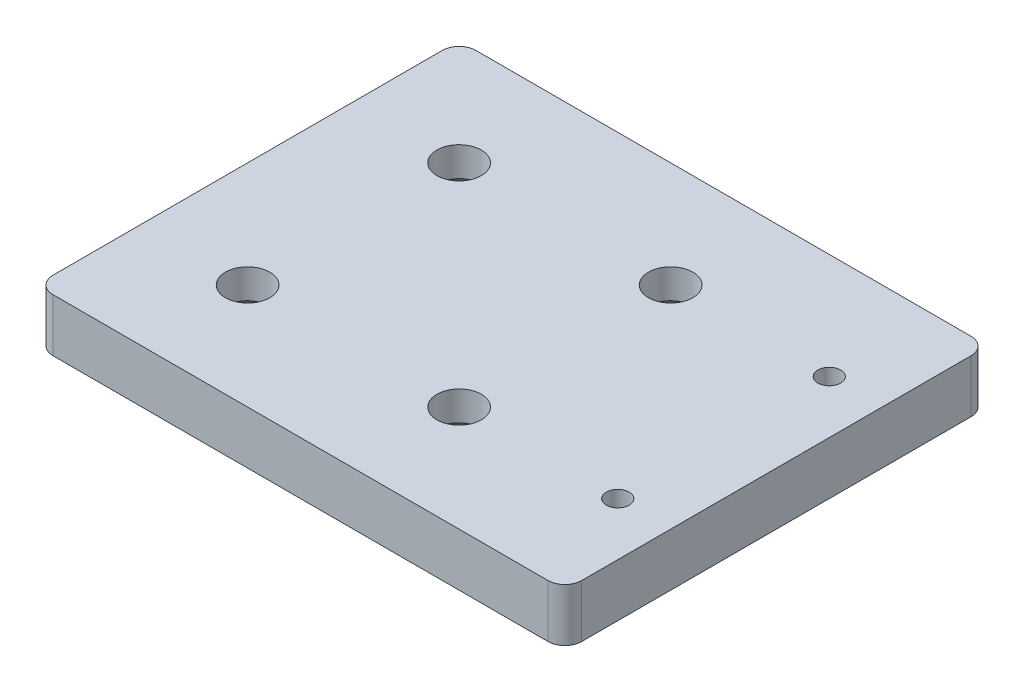
ISO-10303-21;
HEADER;
FILE_DESCRIPTION(('STEP AP214'),'2;1');
FILE_NAME('part.step','',(''),(''),'','','');
FILE_SCHEMA(('AUTOMOTIVE_DESIGN { 1 0 10303 214 1 1 1 1 }'));
ENDSEC;
DATA;
#1=APPLICATION_CONTEXT('core data for automotive mechanical design processes');
#2=APPLICATION_PROTOCOL_DEFINITION('international standard','automotive_design',2000,#1);
#3=PRODUCT_CONTEXT('',#1,'mechanical');
#4=PRODUCT('Part','Part','',(#3));
#5=PRODUCT_RELATED_PRODUCT_CATEGORY('part','',(#4));
#6=PRODUCT_DEFINITION_FORMATION('','',#4);
#7=PRODUCT_DEFINITION_CONTEXT('part definition',#1,'design');
#8=PRODUCT_DEFINITION('design','',#6,#7);
#9=PRODUCT_DEFINITION_SHAPE('','',#8);
#10=(LENGTH_UNIT() NAMED_UNIT(*) SI_UNIT(.MILLI.,.METRE.));
#11=(NAMED_UNIT(*) PLANE_ANGLE_UNIT() SI_UNIT($,.RADIAN.));
#12=(NAMED_UNIT(*) SI_UNIT($,.STERADIAN.) SOLID_ANGLE_UNIT());
#13=UNCERTAINTY_MEASURE_WITH_UNIT(LENGTH_MEASURE(1.E-05),#10,'distance_accuracy_value','');
#14=(GEOMETRIC_REPRESENTATION_CONTEXT(3) GLOBAL_UNCERTAINTY_ASSIGNED_CONTEXT((#13)) GLOBAL_UNIT_ASSIGNED_CONTEXT((#10,
#11,#12)) REPRESENTATION_CONTEXT('',''));
#15=CARTESIAN_POINT('',(0.,0.,0.));
#16=DIRECTION('',(0.,0.,1.));
#17=DIRECTION('',(1.,0.,0.));
#18=AXIS2_PLACEMENT_3D('',#15,#16,#17);
#19=CARTESIAN_POINT('',(-46.82,10.,36.82));
#20=DIRECTION('',(0.,-1.,0.));
#21=DIRECTION('',(0.,0.,-1.));
#22=AXIS2_PLACEMENT_3D('',#19,#20,#21);
#23=CYLINDRICAL_SURFACE('',#22,3.17999999999999);
#24=CARTESIAN_POINT('',(-46.82,0.,36.82));
#25=DIRECTION('',(0.,-1.,0.));
#26=DIRECTION('',(0.,0.,-1.));
#27=AXIS2_PLACEMENT_3D('',#24,#25,#26);
#28=CIRCLE('',#27,3.17999999999999);
#29=CARTESIAN_POINT('',(-46.82,0.,40.));
#30=VERTEX_POINT('',#29);
#31=CARTESIAN_POINT('',(-50.,0.,36.82));
#32=VERTEX_POINT('',#31);
#33=EDGE_CURVE('E140',#30,#32,#28,.T.);
#34=ORIENTED_EDGE('',*,*,#33,.F.);
#35=DIRECTION('',(0.,-1.,0.));
#36=VECTOR('',#35,1.);
#37=CARTESIAN_POINT('',(-46.82,10.,40.));
#38=LINE('',#37,#36);
#39=CARTESIAN_POINT('',(-46.82,10.,40.));
#40=VERTEX_POINT('',#39);
#41=EDGE_CURVE('E11',#40,#30,#38,.T.);
#42=ORIENTED_EDGE('',*,*,#41,.F.);
#43=CARTESIAN_POINT('',(-46.82,10.,36.82));
#44=DIRECTION('',(0.,-1.,0.));
#45=DIRECTION('',(0.,0.,-1.));
#46=AXIS2_PLACEMENT_3D('',#43,#44,#45);
#47=CIRCLE('',#46,3.17999999999999);
#48=CARTESIAN_POINT('',(-50.,10.,36.82));
#49=VERTEX_POINT('',#48);
#50=EDGE_CURVE('E160',#40,#49,#47,.T.);
#51=ORIENTED_EDGE('',*,*,#50,.T.);
#52=DIRECTION('',(0.,-1.,0.));
#53=VECTOR('',#52,1.);
#54=CARTESIAN_POINT('',(-50.,10.,36.82));
#55=LINE('',#54,#53);
#56=EDGE_CURVE('E45',#49,#32,#55,.T.);
#57=ORIENTED_EDGE('',*,*,#56,.T.);
#58=EDGE_LOOP('',(#34,#42,#51,#57));
#59=FACE_BOUND('',#58,.T.);
#60=ADVANCED_FACE('F39',(#59),#23,.T.);
#61=CARTESIAN_POINT('',(-46.82,10.,40.));
#62=DIRECTION('',(0.,0.,-1.));
#63=DIRECTION('',(-1.,0.,0.));
#64=AXIS2_PLACEMENT_3D('',#61,#62,#63);
#65=PLANE('',#64);
#66=DIRECTION('',(1.,0.,0.));
#67=VECTOR('',#66,1.);
#68=CARTESIAN_POINT('',(-46.82,0.,40.));
#69=LINE('',#68,#67);
#70=CARTESIAN_POINT('',(46.82,0.,40.));
#71=VERTEX_POINT('',#70);
#72=EDGE_CURVE('E81',#30,#71,#69,.T.);
#73=ORIENTED_EDGE('',*,*,#72,.T.);
#74=DIRECTION('',(0.,-1.,0.));
#75=VECTOR('',#74,1.);
#76=CARTESIAN_POINT('',(46.82,10.,40.));
#77=LINE('',#76,#75);
#78=CARTESIAN_POINT('',(46.82,10.,40.));
#79=VERTEX_POINT('',#78);
#80=EDGE_CURVE('E48',#79,#71,#77,.T.);
#81=ORIENTED_EDGE('',*,*,#80,.F.);
#82=DIRECTION('',(1.,0.,0.));
#83=VECTOR('',#82,1.);
#84=CARTESIAN_POINT('',(-46.82,10.,40.));
#85=LINE('',#84,#83);
#86=EDGE_CURVE('E119',#40,#79,#85,.T.);
#87=ORIENTED_EDGE('',*,*,#86,.F.);
#88=ORIENTED_EDGE('',*,*,#41,.T.);
#89=EDGE_LOOP('',(#73,#81,#87,#88));
#90=FACE_BOUND('',#89,.T.);
#91=ADVANCED_FACE('F264',(#90),#65,.F.);
#92=CARTESIAN_POINT('',(46.82,10.,36.82));
#93=DIRECTION('',(0.,-1.,0.));
#94=DIRECTION('',(0.,0.,-1.));
#95=AXIS2_PLACEMENT_3D('',#92,#93,#94);
#96=CYLINDRICAL_SURFACE('',#95,3.18);
#97=CARTESIAN_POINT('',(46.82,0.,36.82));
#98=DIRECTION('',(0.,1.,0.));
#99=DIRECTION('',(0.,0.,1.));
#100=AXIS2_PLACEMENT_3D('',#97,#98,#99);
#101=CIRCLE('',#100,3.18);
#102=CARTESIAN_POINT('',(50.,0.,36.82));
#103=VERTEX_POINT('',#102);
#104=EDGE_CURVE('E125',#71,#103,#101,.T.);
#105=ORIENTED_EDGE('',*,*,#104,.T.);
#106=DIRECTION('',(0.,-1.,0.));
#107=VECTOR('',#106,1.);
#108=CARTESIAN_POINT('',(50.,10.,36.82));
#109=LINE('',#108,#107);
#110=CARTESIAN_POINT('',(50.,10.,36.82));
#111=VERTEX_POINT('',#110);
#112=EDGE_CURVE('E117',#111,#103,#109,.T.);
#113=ORIENTED_EDGE('',*,*,#112,.F.);
#114=CARTESIAN_POINT('',(46.82,10.,36.82));
#115=DIRECTION('',(0.,1.,0.));
#116=DIRECTION('',(0.,0.,1.));
#117=AXIS2_PLACEMENT_3D('',#114,#115,#116);
#118=CIRCLE('',#117,3.18);
#119=EDGE_CURVE('E107',#79,#111,#118,.T.);
#120=ORIENTED_EDGE('',*,*,#119,.F.);
#121=ORIENTED_EDGE('',*,*,#80,.T.);
#122=EDGE_LOOP('',(#105,#113,#120,#121));
#123=FACE_BOUND('',#122,.T.);
#124=ADVANCED_FACE('F122',(#123),#96,.T.);
#125=CARTESIAN_POINT('',(50.,10.,36.82));
#126=DIRECTION('',(-1.,0.,0.));
#127=DIRECTION('',(0.,0.,1.));
#128=AXIS2_PLACEMENT_3D('',#125,#126,#127);
#129=PLANE('',#128);
#130=DIRECTION('',(0.,0.,-1.));
#131=VECTOR('',#130,1.);
#132=CARTESIAN_POINT('',(50.,0.,36.82));
#133=LINE('',#132,#131);
#134=CARTESIAN_POINT('',(50.,0.,-36.82));
#135=VERTEX_POINT('',#134);
#136=EDGE_CURVE('E152',#103,#135,#133,.T.);
#137=ORIENTED_EDGE('',*,*,#136,.T.);
#138=DIRECTION('',(0.,-1.,0.));
#139=VECTOR('',#138,1.);
#140=CARTESIAN_POINT('',(50.,10.,-36.82));
#141=LINE('',#140,#139);
#142=CARTESIAN_POINT('',(50.,10.,-36.82));
#143=VERTEX_POINT('',#142);
#144=EDGE_CURVE('E130',#143,#135,#141,.T.);
#145=ORIENTED_EDGE('',*,*,#144,.F.);
#146=DIRECTION('',(0.,0.,-1.));
#147=VECTOR('',#146,1.);
#148=CARTESIAN_POINT('',(50.,10.,36.82));
#149=LINE('',#148,#147);
#150=EDGE_CURVE('E111',#111,#143,#149,.T.);
#151=ORIENTED_EDGE('',*,*,#150,.F.);
#152=ORIENTED_EDGE('',*,*,#112,.T.);
#153=EDGE_LOOP('',(#137,#145,#151,#152));
#154=FACE_BOUND('',#153,.T.);
#155=ADVANCED_FACE('F129',(#154),#129,.F.);
#156=CARTESIAN_POINT('',(46.82,10.,-36.82));
#157=DIRECTION('',(0.,-1.,0.));
#158=DIRECTION('',(0.,0.,-1.));
#159=AXIS2_PLACEMENT_3D('',#156,#157,#158);
#160=CYLINDRICAL_SURFACE('',#159,3.18);
#161=CARTESIAN_POINT('',(46.82,0.,-36.82));
#162=DIRECTION('',(0.,-1.,0.));
#163=DIRECTION('',(0.,0.,-1.));
#164=AXIS2_PLACEMENT_3D('',#161,#162,#163);
#165=CIRCLE('',#164,3.18);
#166=CARTESIAN_POINT('',(46.82,0.,-40.));
#167=VERTEX_POINT('',#166);
#168=EDGE_CURVE('E151',#167,#135,#165,.T.);
#169=ORIENTED_EDGE('',*,*,#168,.F.);
#170=DIRECTION('',(0.,-1.,0.));
#171=VECTOR('',#170,1.);
#172=CARTESIAN_POINT('',(46.82,10.,-40.));
#173=LINE('',#172,#171);
#174=CARTESIAN_POINT('',(46.82,10.,-40.));
#175=VERTEX_POINT('',#174);
#176=EDGE_CURVE('E161',#175,#167,#173,.T.);
#177=ORIENTED_EDGE('',*,*,#176,.F.);
#178=CARTESIAN_POINT('',(46.82,10.,-36.82));
#179=DIRECTION('',(0.,-1.,0.));
#180=DIRECTION('',(0.,0.,-1.));
#181=AXIS2_PLACEMENT_3D('',#178,#179,#180);
#182=CIRCLE('',#181,3.18);
#183=EDGE_CURVE('E134',#175,#143,#182,.T.);
#184=ORIENTED_EDGE('',*,*,#183,.T.);
#185=ORIENTED_EDGE('',*,*,#144,.T.);
#186=EDGE_LOOP('',(#169,#177,#184,#185));
#187=FACE_BOUND('',#186,.T.);
#188=ADVANCED_FACE('F171',(#187),#160,.T.);
#189=CARTESIAN_POINT('',(-46.82,10.,-40.));
#190=DIRECTION('',(0.,0.,-1.));
#191=DIRECTION('',(-1.,0.,0.));
#192=AXIS2_PLACEMENT_3D('',#189,#190,#191);
#193=PLANE('',#192);
#194=DIRECTION('',(1.,0.,0.));
#195=VECTOR('',#194,1.);
#196=CARTESIAN_POINT('',(-46.82,0.,-40.));
#197=LINE('',#196,#195);
#198=CARTESIAN_POINT('',(-46.82,0.,-40.));
#199=VERTEX_POINT('',#198);
#200=EDGE_CURVE('E146',#199,#167,#197,.T.);
#201=ORIENTED_EDGE('',*,*,#200,.F.);
#202=DIRECTION('',(0.,-1.,0.));
#203=VECTOR('',#202,1.);
#204=CARTESIAN_POINT('',(-46.82,10.,-40.));
#205=LINE('',#204,#203);
#206=CARTESIAN_POINT('',(-46.82,10.,-40.));
#207=VERTEX_POINT('',#206);
#208=EDGE_CURVE('E162',#207,#199,#205,.T.);
#209=ORIENTED_EDGE('',*,*,#208,.F.);
#210=DIRECTION('',(1.,0.,0.));
#211=VECTOR('',#210,1.);
#212=CARTESIAN_POINT('',(-46.82,10.,-40.));
#213=LINE('',#212,#211);
#214=EDGE_CURVE('E135',#207,#175,#213,.T.);
#215=ORIENTED_EDGE('',*,*,#214,.T.);
#216=ORIENTED_EDGE('',*,*,#176,.T.);
#217=EDGE_LOOP('',(#201,#209,#215,#216));
#218=FACE_BOUND('',#217,.T.);
#219=ADVANCED_FACE('F180',(#218),#193,.T.);
#220=CARTESIAN_POINT('',(-46.82,10.,-36.82));
#221=DIRECTION('',(0.,-1.,0.));
#222=DIRECTION('',(0.,0.,-1.));
#223=AXIS2_PLACEMENT_3D('',#220,#221,#222);
#224=CYLINDRICAL_SURFACE('',#223,3.18);
#225=CARTESIAN_POINT('',(-46.82,0.,-36.82));
#226=DIRECTION('',(0.,-1.,0.));
#227=DIRECTION('',(0.,0.,-1.));
#228=AXIS2_PLACEMENT_3D('',#225,#226,#227);
#229=CIRCLE('',#228,3.18);
#230=CARTESIAN_POINT('',(-50.,0.,-36.82));
#231=VERTEX_POINT('',#230);
#232=EDGE_CURVE('E144',#231,#199,#229,.T.);
#233=ORIENTED_EDGE('',*,*,#232,.F.);
#234=DIRECTION('',(0.,-1.,0.));
#235=VECTOR('',#234,1.);
#236=CARTESIAN_POINT('',(-50.,10.,-36.82));
#237=LINE('',#236,#235);
#238=CARTESIAN_POINT('',(-50.,10.,-36.82));
#239=VERTEX_POINT('',#238);
#240=EDGE_CURVE('E163',#239,#231,#237,.T.);
#241=ORIENTED_EDGE('',*,*,#240,.F.);
#242=CARTESIAN_POINT('',(-46.82,10.,-36.82));
#243=DIRECTION('',(0.,-1.,0.));
#244=DIRECTION('',(0.,0.,-1.));
#245=AXIS2_PLACEMENT_3D('',#242,#243,#244);
#246=CIRCLE('',#245,3.18);
#247=EDGE_CURVE('E176',#239,#207,#246,.T.);
#248=ORIENTED_EDGE('',*,*,#247,.T.);
#249=ORIENTED_EDGE('',*,*,#208,.T.);
#250=EDGE_LOOP('',(#233,#241,#248,#249));
#251=FACE_BOUND('',#250,.T.);
#252=ADVANCED_FACE('F281',(#251),#224,.T.);
#253=CARTESIAN_POINT('',(-50.,10.,36.82));
#254=DIRECTION('',(-1.,0.,0.));
#255=DIRECTION('',(0.,0.,1.));
#256=AXIS2_PLACEMENT_3D('',#253,#254,#255);
#257=PLANE('',#256);
#258=DIRECTION('',(0.,0.,-1.));
#259=VECTOR('',#258,1.);
#260=CARTESIAN_POINT('',(-50.,0.,36.82));
#261=LINE('',#260,#259);
#262=EDGE_CURVE('E143',#32,#231,#261,.T.);
#263=ORIENTED_EDGE('',*,*,#262,.F.);
#264=ORIENTED_EDGE('',*,*,#56,.F.);
#265=DIRECTION('',(0.,0.,-1.));
#266=VECTOR('',#265,1.);
#267=CARTESIAN_POINT('',(-50.,10.,36.82));
#268=LINE('',#267,#266);
#269=EDGE_CURVE('E178',#49,#239,#268,.T.);
#270=ORIENTED_EDGE('',*,*,#269,.T.);
#271=ORIENTED_EDGE('',*,*,#240,.T.);
#272=EDGE_LOOP('',(#263,#264,#270,#271));
#273=FACE_BOUND('',#272,.T.);
#274=ADVANCED_FACE('F167',(#273),#257,.T.);
#275=CARTESIAN_POINT('',(-46.82,10.,36.82));
#276=DIRECTION('',(0.,-1.,0.));
#277=DIRECTION('',(0.,0.,-1.));
#278=AXIS2_PLACEMENT_3D('',#275,#276,#277);
#279=PLANE('',#278);
#280=CARTESIAN_POINT('',(39.9999999999994,10.,-19.9999999999999));
#281=DIRECTION('',(0.,-1.,0.));
#282=DIRECTION('',(0.,0.,-1.));
#283=AXIS2_PLACEMENT_3D('',#280,#281,#282);
#284=CIRCLE('',#283,2.15);
#285=CARTESIAN_POINT('',(39.9999999999994,10.,-22.1499999999999));
#286=VERTEX_POINT('',#285);
#287=EDGE_CURVE('E229',#286,#286,#284,.T.);
#288=ORIENTED_EDGE('',*,*,#287,.T.);
#289=EDGE_LOOP('',(#288));
#290=FACE_BOUND('',#289,.T.);
#291=CARTESIAN_POINT('',(40.,10.,19.999999999999));
#292=DIRECTION('',(0.,-1.,0.));
#293=DIRECTION('',(0.,0.,-1.));
#294=AXIS2_PLACEMENT_3D('',#291,#292,#293);
#295=CIRCLE('',#294,2.15);
#296=CARTESIAN_POINT('',(40.,10.,17.849999999999));
#297=VERTEX_POINT('',#296);
#298=EDGE_CURVE('E219',#297,#297,#295,.T.);
#299=ORIENTED_EDGE('',*,*,#298,.T.);
#300=EDGE_LOOP('',(#299));
#301=FACE_BOUND('',#300,.T.);
#302=CARTESIAN_POINT('',(10.,9.99999999999999,-20.));
#303=DIRECTION('',(0.,-1.,0.));
#304=DIRECTION('',(0.,0.,-1.));
#305=AXIS2_PLACEMENT_3D('',#302,#303,#304);
#306=CIRCLE('',#305,4.19999999999999);
#307=CARTESIAN_POINT('',(10.,9.99999999999999,-24.2));
#308=VERTEX_POINT('',#307);
#309=EDGE_CURVE('E211',#308,#308,#306,.T.);
#310=ORIENTED_EDGE('',*,*,#309,.T.);
#311=EDGE_LOOP('',(#310));
#312=FACE_BOUND('',#311,.T.);
#313=CARTESIAN_POINT('',(-30.0000000000008,9.99999999999999,-19.9999999999989));
#314=DIRECTION('',(0.,-1.,0.));
#315=DIRECTION('',(0.,0.,-1.));
#316=AXIS2_PLACEMENT_3D('',#313,#314,#315);
#317=CIRCLE('',#316,4.19999999999999);
#318=CARTESIAN_POINT('',(-30.0000000000008,9.99999999999999,-24.1999999999989));
#319=VERTEX_POINT('',#318);
#320=EDGE_CURVE('E205',#319,#319,#317,.T.);
#321=ORIENTED_EDGE('',*,*,#320,.T.);
#322=EDGE_LOOP('',(#321));
#323=FACE_BOUND('',#322,.T.);
#324=CARTESIAN_POINT('',(-29.9999999999996,9.99999999999999,20.));
#325=DIRECTION('',(0.,-1.,0.));
#326=DIRECTION('',(0.,0.,-1.));
#327=AXIS2_PLACEMENT_3D('',#324,#325,#326);
#328=CIRCLE('',#327,4.19999999999999);
#329=CARTESIAN_POINT('',(-29.9999999999996,9.99999999999999,15.8));
#330=VERTEX_POINT('',#329);
#331=EDGE_CURVE('E195',#330,#330,#328,.T.);
#332=ORIENTED_EDGE('',*,*,#331,.T.);
#333=EDGE_LOOP('',(#332));
#334=FACE_BOUND('',#333,.T.);
#335=CARTESIAN_POINT('',(10.0000000000004,9.99999999999999,20.));
#336=DIRECTION('',(0.,-1.,0.));
#337=DIRECTION('',(0.,0.,-1.));
#338=AXIS2_PLACEMENT_3D('',#335,#336,#337);
#339=CIRCLE('',#338,4.19999999999999);
#340=CARTESIAN_POINT('',(10.0000000000004,9.99999999999999,15.8));
#341=VERTEX_POINT('',#340);
#342=EDGE_CURVE('E142',#341,#341,#339,.T.);
#343=ORIENTED_EDGE('',*,*,#342,.T.);
#344=EDGE_LOOP('',(#343));
#345=FACE_BOUND('',#344,.T.);
#346=ORIENTED_EDGE('',*,*,#50,.F.);
#347=ORIENTED_EDGE('',*,*,#86,.T.);
#348=ORIENTED_EDGE('',*,*,#119,.T.);
#349=ORIENTED_EDGE('',*,*,#150,.T.);
#350=ORIENTED_EDGE('',*,*,#183,.F.);
#351=ORIENTED_EDGE('',*,*,#214,.F.);
#352=ORIENTED_EDGE('',*,*,#247,.F.);
#353=ORIENTED_EDGE('',*,*,#269,.F.);
#354=EDGE_LOOP('',(#346,#347,#348,#349,#350,#351,#352,#353));
#355=FACE_BOUND('',#354,.T.);
#356=ADVANCED_FACE('F112',(#290,#301,#312,#323,#334,#345,#355),#279,.F.);
#357=CARTESIAN_POINT('',(-46.82,0.,36.82));
#358=DIRECTION('',(0.,-1.,0.));
#359=DIRECTION('',(0.,0.,-1.));
#360=AXIS2_PLACEMENT_3D('',#357,#358,#359);
#361=PLANE('',#360);
#362=CARTESIAN_POINT('',(39.9999999999994,0.,-19.9999999999999));
#363=DIRECTION('',(0.,-1.,0.));
#364=DIRECTION('',(0.,0.,-1.));
#365=AXIS2_PLACEMENT_3D('',#362,#363,#364);
#366=CIRCLE('',#365,2.15);
#367=CARTESIAN_POINT('',(39.9999999999994,0.,-22.1499999999999));
#368=VERTEX_POINT('',#367);
#369=EDGE_CURVE('E228',#368,#368,#366,.T.);
#370=ORIENTED_EDGE('',*,*,#369,.F.);
#371=EDGE_LOOP('',(#370));
#372=FACE_BOUND('',#371,.T.);
#373=CARTESIAN_POINT('',(40.,0.,19.999999999999));
#374=DIRECTION('',(0.,-1.,0.));
#375=DIRECTION('',(0.,0.,-1.));
#376=AXIS2_PLACEMENT_3D('',#373,#374,#375);
#377=CIRCLE('',#376,2.15);
#378=CARTESIAN_POINT('',(40.,0.,17.849999999999));
#379=VERTEX_POINT('',#378);
#380=EDGE_CURVE('E224',#379,#379,#377,.T.);
#381=ORIENTED_EDGE('',*,*,#380,.F.);
#382=EDGE_LOOP('',(#381));
#383=FACE_BOUND('',#382,.T.);
#384=CARTESIAN_POINT('',(10.,0.,-20.));
#385=DIRECTION('',(0.,-1.,0.));
#386=DIRECTION('',(0.,0.,-1.));
#387=AXIS2_PLACEMENT_3D('',#384,#385,#386);
#388=CIRCLE('',#387,8.65);
#389=CARTESIAN_POINT('',(10.,0.,-28.65));
#390=VERTEX_POINT('',#389);
#391=EDGE_CURVE('E220',#390,#390,#388,.T.);
#392=ORIENTED_EDGE('',*,*,#391,.F.);
#393=EDGE_LOOP('',(#392));
#394=FACE_BOUND('',#393,.T.);
#395=CARTESIAN_POINT('',(-30.0000000000008,0.,-19.9999999999989));
#396=DIRECTION('',(0.,-1.,0.));
#397=DIRECTION('',(0.,0.,-1.));
#398=AXIS2_PLACEMENT_3D('',#395,#396,#397);
#399=CIRCLE('',#398,8.65);
#400=CARTESIAN_POINT('',(-30.0000000000008,0.,-28.6499999999989));
#401=VERTEX_POINT('',#400);
#402=EDGE_CURVE('E208',#401,#401,#399,.T.);
#403=ORIENTED_EDGE('',*,*,#402,.F.);
#404=EDGE_LOOP('',(#403));
#405=FACE_BOUND('',#404,.T.);
#406=CARTESIAN_POINT('',(-29.9999999999996,0.,20.));
#407=DIRECTION('',(0.,-1.,0.));
#408=DIRECTION('',(0.,0.,-1.));
#409=AXIS2_PLACEMENT_3D('',#406,#407,#408);
#410=CIRCLE('',#409,8.65);
#411=CARTESIAN_POINT('',(-29.9999999999996,0.,11.35));
#412=VERTEX_POINT('',#411);
#413=EDGE_CURVE('E200',#412,#412,#410,.T.);
#414=ORIENTED_EDGE('',*,*,#413,.F.);
#415=EDGE_LOOP('',(#414));
#416=FACE_BOUND('',#415,.T.);
#417=CARTESIAN_POINT('',(10.0000000000004,0.,20.));
#418=DIRECTION('',(0.,-1.,0.));
#419=DIRECTION('',(0.,0.,-1.));
#420=AXIS2_PLACEMENT_3D('',#417,#418,#419);
#421=CIRCLE('',#420,8.65);
#422=CARTESIAN_POINT('',(10.0000000000004,0.,11.35));
#423=VERTEX_POINT('',#422);
#424=EDGE_CURVE('E187',#423,#423,#421,.T.);
#425=ORIENTED_EDGE('',*,*,#424,.F.);
#426=EDGE_LOOP('',(#425));
#427=FACE_BOUND('',#426,.T.);
#428=ORIENTED_EDGE('',*,*,#33,.T.);
#429=ORIENTED_EDGE('',*,*,#262,.T.);
#430=ORIENTED_EDGE('',*,*,#232,.T.);
#431=ORIENTED_EDGE('',*,*,#200,.T.);
#432=ORIENTED_EDGE('',*,*,#168,.T.);
#433=ORIENTED_EDGE('',*,*,#136,.F.);
#434=ORIENTED_EDGE('',*,*,#104,.F.);
#435=ORIENTED_EDGE('',*,*,#72,.F.);
#436=EDGE_LOOP('',(#428,#429,#430,#431,#432,#433,#434,#435));
#437=FACE_BOUND('',#436,.T.);
#438=ADVANCED_FACE('F169',(#372,#383,#394,#405,#416,#427,#437),#361,.T.);
#439=CARTESIAN_POINT('',(10.0000000000004,0.,20.));
#440=DIRECTION('',(0.,-1.,0.));
#441=DIRECTION('',(0.,0.,-1.));
#442=AXIS2_PLACEMENT_3D('',#439,#440,#441);
#443=CYLINDRICAL_SURFACE('',#442,4.19999999999999);
#444=ORIENTED_EDGE('',*,*,#342,.F.);
#445=EDGE_LOOP('',(#444));
#446=FACE_BOUND('',#445,.T.);
#447=CARTESIAN_POINT('',(10.0000000000004,4.45,20.));
#448=DIRECTION('',(0.,-1.,0.));
#449=DIRECTION('',(0.,0.,-1.));
#450=AXIS2_PLACEMENT_3D('',#447,#448,#449);
#451=CIRCLE('',#450,4.2);
#452=CARTESIAN_POINT('',(10.0000000000004,4.45,15.8));
#453=VERTEX_POINT('',#452);
#454=EDGE_CURVE('E186',#453,#453,#451,.T.);
#455=ORIENTED_EDGE('',*,*,#454,.T.);
#456=EDGE_LOOP('',(#455));
#457=FACE_BOUND('',#456,.T.);
#458=ADVANCED_FACE('F240',(#446,#457),#443,.F.);
#459=CARTESIAN_POINT('',(10.0000000000004,0.,20.));
#460=DIRECTION('',(0.,-1.,0.));
#461=DIRECTION('',(0.,0.,-1.));
#462=AXIS2_PLACEMENT_3D('',#459,#460,#461);
#463=CONICAL_SURFACE('',#462,8.65,0.785398163397449);
#464=ORIENTED_EDGE('',*,*,#454,.F.);
#465=EDGE_LOOP('',(#464));
#466=FACE_BOUND('',#465,.T.);
#467=ORIENTED_EDGE('',*,*,#424,.T.);
#468=EDGE_LOOP('',(#467));
#469=FACE_BOUND('',#468,.T.);
#470=ADVANCED_FACE('F246',(#466,#469),#463,.F.);
#471=CARTESIAN_POINT('',(-29.9999999999996,0.,20.));
#472=DIRECTION('',(0.,-1.,0.));
#473=DIRECTION('',(0.,0.,-1.));
#474=AXIS2_PLACEMENT_3D('',#471,#472,#473);
#475=CYLINDRICAL_SURFACE('',#474,4.19999999999999);
#476=ORIENTED_EDGE('',*,*,#331,.F.);
#477=EDGE_LOOP('',(#476));
#478=FACE_BOUND('',#477,.T.);
#479=CARTESIAN_POINT('',(-29.9999999999996,4.45,20.));
#480=DIRECTION('',(0.,-1.,0.));
#481=DIRECTION('',(0.,0.,-1.));
#482=AXIS2_PLACEMENT_3D('',#479,#480,#481);
#483=CIRCLE('',#482,4.2);
#484=CARTESIAN_POINT('',(-29.9999999999996,4.45,15.8));
#485=VERTEX_POINT('',#484);
#486=EDGE_CURVE('E198',#485,#485,#483,.T.);
#487=ORIENTED_EDGE('',*,*,#486,.T.);
#488=EDGE_LOOP('',(#487));
#489=FACE_BOUND('',#488,.T.);
#490=ADVANCED_FACE('F253',(#478,#489),#475,.F.);
#491=CARTESIAN_POINT('',(-29.9999999999996,0.,20.));
#492=DIRECTION('',(0.,-1.,0.));
#493=DIRECTION('',(0.,0.,-1.));
#494=AXIS2_PLACEMENT_3D('',#491,#492,#493);
#495=CONICAL_SURFACE('',#494,8.65,0.785398163397449);
#496=ORIENTED_EDGE('',*,*,#486,.F.);
#497=EDGE_LOOP('',(#496));
#498=FACE_BOUND('',#497,.T.);
#499=ORIENTED_EDGE('',*,*,#413,.T.);
#500=EDGE_LOOP('',(#499));
#501=FACE_BOUND('',#500,.T.);
#502=ADVANCED_FACE('F256',(#498,#501),#495,.F.);
#503=CARTESIAN_POINT('',(-30.0000000000008,0.,-19.9999999999989));
#504=DIRECTION('',(0.,-1.,0.));
#505=DIRECTION('',(0.,0.,-1.));
#506=AXIS2_PLACEMENT_3D('',#503,#504,#505);
#507=CYLINDRICAL_SURFACE('',#506,4.19999999999999);
#508=ORIENTED_EDGE('',*,*,#320,.F.);
#509=EDGE_LOOP('',(#508));
#510=FACE_BOUND('',#509,.T.);
#511=CARTESIAN_POINT('',(-30.0000000000008,4.45,-19.9999999999989));
#512=DIRECTION('',(0.,-1.,0.));
#513=DIRECTION('',(0.,0.,-1.));
#514=AXIS2_PLACEMENT_3D('',#511,#512,#513);
#515=CIRCLE('',#514,4.2);
#516=CARTESIAN_POINT('',(-30.0000000000008,4.45,-24.1999999999989));
#517=VERTEX_POINT('',#516);
#518=EDGE_CURVE('E202',#517,#517,#515,.T.);
#519=ORIENTED_EDGE('',*,*,#518,.T.);
#520=EDGE_LOOP('',(#519));
#521=FACE_BOUND('',#520,.T.);
#522=ADVANCED_FACE('F309',(#510,#521),#507,.F.);
#523=CARTESIAN_POINT('',(-30.0000000000008,0.,-19.9999999999989));
#524=DIRECTION('',(0.,-1.,0.));
#525=DIRECTION('',(0.,0.,-1.));
#526=AXIS2_PLACEMENT_3D('',#523,#524,#525);
#527=CONICAL_SURFACE('',#526,8.65,0.785398163397448);
#528=ORIENTED_EDGE('',*,*,#518,.F.);
#529=EDGE_LOOP('',(#528));
#530=FACE_BOUND('',#529,.T.);
#531=ORIENTED_EDGE('',*,*,#402,.T.);
#532=EDGE_LOOP('',(#531));
#533=FACE_BOUND('',#532,.T.);
#534=ADVANCED_FACE('F312',(#530,#533),#527,.F.);
#535=CARTESIAN_POINT('',(10.,0.,-20.));
#536=DIRECTION('',(0.,-1.,0.));
#537=DIRECTION('',(0.,0.,-1.));
#538=AXIS2_PLACEMENT_3D('',#535,#536,#537);
#539=CYLINDRICAL_SURFACE('',#538,4.19999999999999);
#540=ORIENTED_EDGE('',*,*,#309,.F.);
#541=EDGE_LOOP('',(#540));
#542=FACE_BOUND('',#541,.T.);
#543=CARTESIAN_POINT('',(10.,4.45,-20.));
#544=DIRECTION('',(0.,-1.,0.));
#545=DIRECTION('',(0.,0.,-1.));
#546=AXIS2_PLACEMENT_3D('',#543,#544,#545);
#547=CIRCLE('',#546,4.2);
#548=CARTESIAN_POINT('',(10.,4.45,-24.2));
#549=VERTEX_POINT('',#548);
#550=EDGE_CURVE('E212',#549,#549,#547,.T.);
#551=ORIENTED_EDGE('',*,*,#550,.T.);
#552=EDGE_LOOP('',(#551));
#553=FACE_BOUND('',#552,.T.);
#554=ADVANCED_FACE('F321',(#542,#553),#539,.F.);
#555=CARTESIAN_POINT('',(10.,0.,-20.));
#556=DIRECTION('',(0.,-1.,0.));
#557=DIRECTION('',(0.,0.,-1.));
#558=AXIS2_PLACEMENT_3D('',#555,#556,#557);
#559=CONICAL_SURFACE('',#558,8.65,0.785398163397449);
#560=ORIENTED_EDGE('',*,*,#550,.F.);
#561=EDGE_LOOP('',(#560));
#562=FACE_BOUND('',#561,.T.);
#563=ORIENTED_EDGE('',*,*,#391,.T.);
#564=EDGE_LOOP('',(#563));
#565=FACE_BOUND('',#564,.T.);
#566=ADVANCED_FACE('F324',(#562,#565),#559,.F.);
#567=CARTESIAN_POINT('',(40.,0.,19.999999999999));
#568=DIRECTION('',(0.,-1.,0.));
#569=DIRECTION('',(0.,0.,-1.));
#570=AXIS2_PLACEMENT_3D('',#567,#568,#569);
#571=CYLINDRICAL_SURFACE('',#570,2.15);
#572=ORIENTED_EDGE('',*,*,#298,.F.);
#573=EDGE_LOOP('',(#572));
#574=FACE_BOUND('',#573,.T.);
#575=ORIENTED_EDGE('',*,*,#380,.T.);
#576=EDGE_LOOP('',(#575));
#577=FACE_BOUND('',#576,.T.);
#578=ADVANCED_FACE('F327',(#574,#577),#571,.F.);
#579=CARTESIAN_POINT('',(39.9999999999994,0.,-19.9999999999999));
#580=DIRECTION('',(0.,-1.,0.));
#581=DIRECTION('',(0.,0.,-1.));
#582=AXIS2_PLACEMENT_3D('',#579,#580,#581);
#583=CYLINDRICAL_SURFACE('',#582,2.15);
#584=ORIENTED_EDGE('',*,*,#287,.F.);
#585=EDGE_LOOP('',(#584));
#586=FACE_BOUND('',#585,.T.);
#587=ORIENTED_EDGE('',*,*,#369,.T.);
#588=EDGE_LOOP('',(#587));
#589=FACE_BOUND('',#588,.T.);
#590=ADVANCED_FACE('F235',(#586,#589),#583,.F.);
#591=CLOSED_SHELL('',(#60,#91,#124,#155,#188,#219,#252,#274,#356,#438,#458,#470,#490,#502,#522,
#534,#554,#566,#578,#590));
#592=MANIFOLD_SOLID_BREP('B2',#591);
#593=ADVANCED_BREP_SHAPE_REPRESENTATION('',(#18,#592),#14);
#594=SHAPE_DEFINITION_REPRESENTATION(#9,#593);
ENDSEC;
END-ISO-10303-21;
